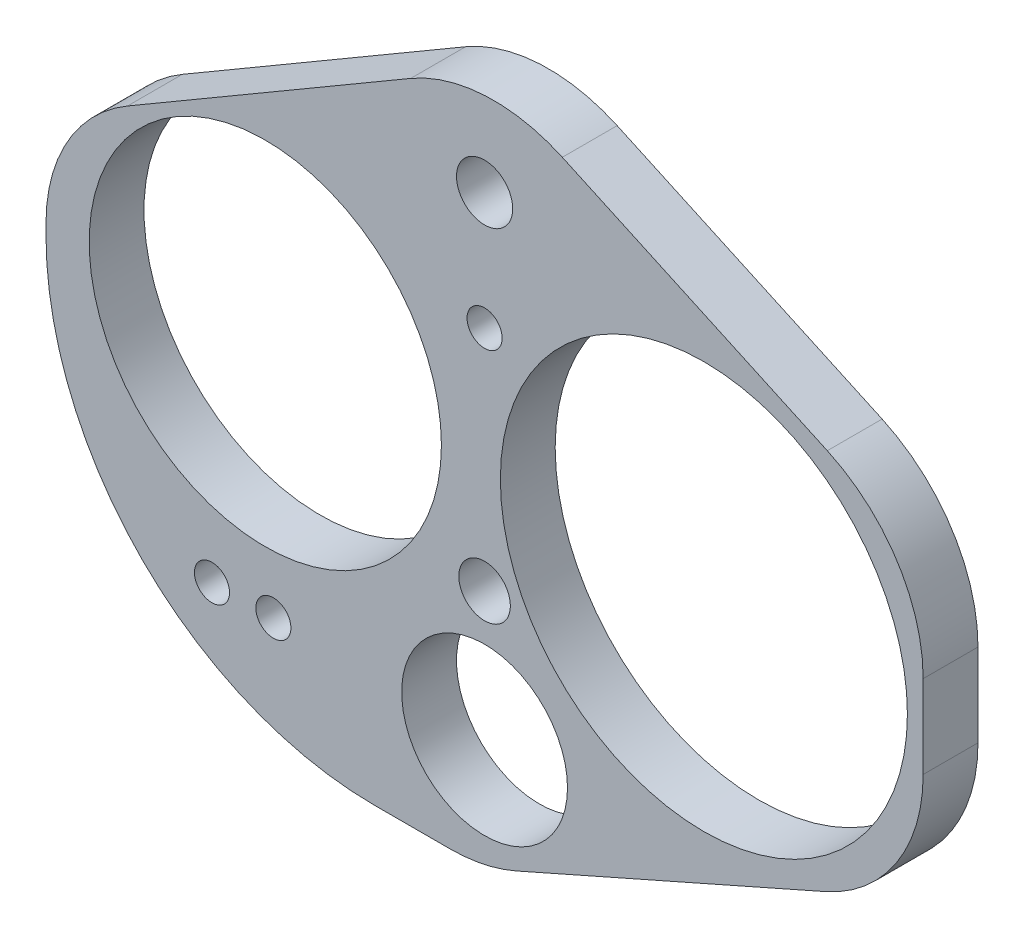
ISO-10303-21;
HEADER;
FILE_DESCRIPTION(('STEP AP214'),'2;1');
FILE_NAME('part.step','',(''),(''),'','','');
FILE_SCHEMA(('AUTOMOTIVE_DESIGN { 1 0 10303 214 1 1 1 1 }'));
ENDSEC;
DATA;
#1=APPLICATION_CONTEXT('core data for automotive mechanical design processes');
#2=APPLICATION_PROTOCOL_DEFINITION('international standard','automotive_design',2000,#1);
#3=PRODUCT_CONTEXT('',#1,'mechanical');
#4=PRODUCT('Part','Part','',(#3));
#5=PRODUCT_RELATED_PRODUCT_CATEGORY('part','',(#4));
#6=PRODUCT_DEFINITION_FORMATION('','',#4);
#7=PRODUCT_DEFINITION_CONTEXT('part definition',#1,'design');
#8=PRODUCT_DEFINITION('design','',#6,#7);
#9=PRODUCT_DEFINITION_SHAPE('','',#8);
#10=(LENGTH_UNIT() NAMED_UNIT(*) SI_UNIT(.MILLI.,.METRE.));
#11=(NAMED_UNIT(*) PLANE_ANGLE_UNIT() SI_UNIT($,.RADIAN.));
#12=(NAMED_UNIT(*) SI_UNIT($,.STERADIAN.) SOLID_ANGLE_UNIT());
#13=UNCERTAINTY_MEASURE_WITH_UNIT(LENGTH_MEASURE(1.E-05),#10,'distance_accuracy_value','');
#14=(GEOMETRIC_REPRESENTATION_CONTEXT(3) GLOBAL_UNCERTAINTY_ASSIGNED_CONTEXT((#13)) GLOBAL_UNIT_ASSIGNED_CONTEXT((#10,
#11,#12)) REPRESENTATION_CONTEXT('',''));
#15=CARTESIAN_POINT('',(0.,0.,0.));
#16=DIRECTION('',(0.,0.,1.));
#17=DIRECTION('',(1.,0.,0.));
#18=AXIS2_PLACEMENT_3D('',#15,#16,#17);
#19=CARTESIAN_POINT('',(14.9199887402892,-33.746005412186,5.));
#20=DIRECTION('',(0.404367078648588,-0.914596777659536,0.));
#21=DIRECTION('',(0.914596777659536,0.404367078648588,0.));
#22=AXIS2_PLACEMENT_3D('',#19,#20,#21);
#23=PLANE('',#22);
#24=DIRECTION('',(-0.914596777659536,-0.404367078648588,0.));
#25=VECTOR('',#24,1.);
#26=CARTESIAN_POINT('',(14.9199887402892,-33.746005412186,5.));
#27=LINE('',#26,#25);
#28=CARTESIAN_POINT('',(51.0655061797288,-17.7651298501373,5.));
#29=VERTEX_POINT('',#28);
#30=CARTESIAN_POINT('',(22.8974729674597,-30.218951664893,5.));
#31=VERTEX_POINT('',#30);
#32=EDGE_CURVE('E255',#29,#31,#27,.T.);
#33=ORIENTED_EDGE('',*,*,#32,.T.);
#34=DIRECTION('',(0.,0.,-1.));
#35=VECTOR('',#34,1.);
#36=CARTESIAN_POINT('',(22.8974729674597,-30.218951664893,0.));
#37=LINE('',#36,#35);
#38=CARTESIAN_POINT('',(22.8974729674597,-30.218951664893,0.));
#39=VERTEX_POINT('',#38);
#40=EDGE_CURVE('E147',#31,#39,#37,.T.);
#41=ORIENTED_EDGE('',*,*,#40,.T.);
#42=DIRECTION('',(-0.914596777659536,-0.404367078648588,0.));
#43=VECTOR('',#42,1.);
#44=CARTESIAN_POINT('',(14.9199887402892,-33.746005412186,0.));
#45=LINE('',#44,#43);
#46=CARTESIAN_POINT('',(51.0655061797288,-17.7651298501373,0.));
#47=VERTEX_POINT('',#46);
#48=EDGE_CURVE('E131',#47,#39,#45,.T.);
#49=ORIENTED_EDGE('',*,*,#48,.F.);
#50=DIRECTION('',(0.,0.,-1.));
#51=VECTOR('',#50,1.);
#52=CARTESIAN_POINT('',(51.0655061797288,-17.7651298501373,5.));
#53=LINE('',#52,#51);
#54=EDGE_CURVE('E144',#47,#29,#53,.F.);
#55=ORIENTED_EDGE('',*,*,#54,.T.);
#56=EDGE_LOOP('',(#33,#41,#49,#55));
#57=FACE_BOUND('',#56,.T.);
#58=ADVANCED_FACE('F41',(#57),#23,.T.);
#59=CARTESIAN_POINT('',(60.,0.,5.));
#60=DIRECTION('',(-1.,0.,0.));
#61=DIRECTION('',(0.,0.,1.));
#62=AXIS2_PLACEMENT_3D('',#59,#60,#61);
#63=PLANE('',#62);
#64=DIRECTION('',(0.,1.,0.));
#65=VECTOR('',#64,1.);
#66=CARTESIAN_POINT('',(60.,0.,5.));
#67=LINE('',#66,#65);
#68=CARTESIAN_POINT('',(60.,-4.04617818524424,5.));
#69=VERTEX_POINT('',#68);
#70=CARTESIAN_POINT('',(60.,3.52175914930494,5.));
#71=VERTEX_POINT('',#70);
#72=EDGE_CURVE('E252',#69,#71,#67,.T.);
#73=ORIENTED_EDGE('',*,*,#72,.F.);
#74=DIRECTION('',(0.,0.,-1.));
#75=VECTOR('',#74,1.);
#76=CARTESIAN_POINT('',(60.,-4.04617818524424,0.));
#77=LINE('',#76,#75);
#78=CARTESIAN_POINT('',(60.,-4.04617818524424,0.));
#79=VERTEX_POINT('',#78);
#80=EDGE_CURVE('E183',#69,#79,#77,.T.);
#81=ORIENTED_EDGE('',*,*,#80,.T.);
#82=DIRECTION('',(0.,1.,0.));
#83=VECTOR('',#82,1.);
#84=CARTESIAN_POINT('',(60.,0.,0.));
#85=LINE('',#84,#83);
#86=CARTESIAN_POINT('',(60.,3.52175914930494,0.));
#87=VERTEX_POINT('',#86);
#88=EDGE_CURVE('E133',#79,#87,#85,.T.);
#89=ORIENTED_EDGE('',*,*,#88,.T.);
#90=DIRECTION('',(0.,0.,-1.));
#91=VECTOR('',#90,1.);
#92=CARTESIAN_POINT('',(60.,3.52175914930494,5.));
#93=LINE('',#92,#91);
#94=EDGE_CURVE('E181',#87,#71,#93,.F.);
#95=ORIENTED_EDGE('',*,*,#94,.T.);
#96=EDGE_LOOP('',(#73,#81,#89,#95));
#97=FACE_BOUND('',#96,.T.);
#98=ADVANCED_FACE('F310',(#97),#63,.F.);
#99=CARTESIAN_POINT('',(15.4215015826315,33.6013254574982,5.));
#100=DIRECTION('',(0.417121690149532,0.908850645379536,0.));
#101=DIRECTION('',(-0.908850645379536,0.417121690149532,0.));
#102=AXIS2_PLACEMENT_3D('',#99,#100,#101);
#103=PLANE('',#102);
#104=DIRECTION('',(0.908850645379536,-0.417121690149532,0.));
#105=VECTOR('',#104,1.);
#106=CARTESIAN_POINT('',(15.4215015826315,33.6013254574982,5.));
#107=LINE('',#106,#105);
#108=CARTESIAN_POINT('',(27.0895478714303,28.2462154474324,5.));
#109=VERTEX_POINT('',#108);
#110=CARTESIAN_POINT('',(51.256825352243,17.154518829998,5.));
#111=VERTEX_POINT('',#110);
#112=EDGE_CURVE('E249',#109,#111,#107,.T.);
#113=ORIENTED_EDGE('',*,*,#112,.T.);
#114=DIRECTION('',(0.,0.,-1.));
#115=VECTOR('',#114,1.);
#116=CARTESIAN_POINT('',(51.256825352243,17.154518829998,0.));
#117=LINE('',#116,#115);
#118=CARTESIAN_POINT('',(51.256825352243,17.154518829998,0.));
#119=VERTEX_POINT('',#118);
#120=EDGE_CURVE('E187',#111,#119,#117,.T.);
#121=ORIENTED_EDGE('',*,*,#120,.T.);
#122=DIRECTION('',(0.908850645379536,-0.417121690149532,0.));
#123=VECTOR('',#122,1.);
#124=CARTESIAN_POINT('',(15.4215015826315,33.6013254574982,0.));
#125=LINE('',#124,#123);
#126=CARTESIAN_POINT('',(27.0895478714303,28.2462154474324,0.));
#127=VERTEX_POINT('',#126);
#128=EDGE_CURVE('E216',#127,#119,#125,.T.);
#129=ORIENTED_EDGE('',*,*,#128,.F.);
#130=DIRECTION('',(0.,0.,-1.));
#131=VECTOR('',#130,1.);
#132=CARTESIAN_POINT('',(27.0895478714303,28.2462154474324,5.));
#133=LINE('',#132,#131);
#134=EDGE_CURVE('E185',#127,#109,#133,.F.);
#135=ORIENTED_EDGE('',*,*,#134,.T.);
#136=EDGE_LOOP('',(#113,#121,#129,#135));
#137=FACE_BOUND('',#136,.T.);
#138=ADVANCED_FACE('F316',(#137),#103,.T.);
#139=CARTESIAN_POINT('',(-8.63068052574687,14.7700800300247,5.));
#140=DIRECTION('',(-0.504516408332865,0.863402104307666,0.));
#141=DIRECTION('',(-0.863402104307666,-0.504516408332865,0.));
#142=AXIS2_PLACEMENT_3D('',#139,#140,#141);
#143=PLANE('',#142);
#144=DIRECTION('',(0.863402104307666,0.504516408332865,0.));
#145=VECTOR('',#144,1.);
#146=CARTESIAN_POINT('',(-8.63068052574687,14.7700800300247,5.));
#147=LINE('',#146,#145);
#148=CARTESIAN_POINT('',(-12.567746124993,12.4695132540203,5.));
#149=VERTEX_POINT('',#148);
#150=CARTESIAN_POINT('',(13.2649763941943,27.5644873313544,5.));
#151=VERTEX_POINT('',#150);
#152=EDGE_CURVE('E246',#149,#151,#147,.T.);
#153=ORIENTED_EDGE('',*,*,#152,.T.);
#154=DIRECTION('',(0.,0.,-1.));
#155=VECTOR('',#154,1.);
#156=CARTESIAN_POINT('',(13.2649763941943,27.5644873313544,5.));
#157=LINE('',#156,#155);
#158=CARTESIAN_POINT('',(13.2649763941943,27.5644873313544,0.));
#159=VERTEX_POINT('',#158);
#160=EDGE_CURVE('E192',#151,#159,#157,.T.);
#161=ORIENTED_EDGE('',*,*,#160,.T.);
#162=DIRECTION('',(0.863402104307666,0.504516408332865,0.));
#163=VECTOR('',#162,1.);
#164=CARTESIAN_POINT('',(-8.63068052574687,14.7700800300247,0.));
#165=LINE('',#164,#163);
#166=CARTESIAN_POINT('',(-12.567746124993,12.4695132540203,0.));
#167=VERTEX_POINT('',#166);
#168=EDGE_CURVE('E213',#167,#159,#165,.T.);
#169=ORIENTED_EDGE('',*,*,#168,.F.);
#170=DIRECTION('',(0.,0.,-1.));
#171=VECTOR('',#170,1.);
#172=CARTESIAN_POINT('',(-12.567746124993,12.4695132540203,5.));
#173=LINE('',#172,#171);
#174=EDGE_CURVE('E190',#167,#149,#173,.F.);
#175=ORIENTED_EDGE('',*,*,#174,.T.);
#176=EDGE_LOOP('',(#153,#161,#169,#175));
#177=FACE_BOUND('',#176,.T.);
#178=ADVANCED_FACE('F370',(#177),#143,.T.);
#179=CARTESIAN_POINT('',(-20.,0.,5.));
#180=DIRECTION('',(-1.,0.,0.));
#181=DIRECTION('',(0.,0.,1.));
#182=AXIS2_PLACEMENT_3D('',#179,#180,#181);
#183=PLANE('',#182);
#184=DIRECTION('',(0.,1.,0.));
#185=VECTOR('',#184,1.);
#186=CARTESIAN_POINT('',(-20.,0.,0.));
#187=LINE('',#186,#185);
#188=CARTESIAN_POINT('',(-20.,-1.49999999999999,0.));
#189=VERTEX_POINT('',#188);
#190=CARTESIAN_POINT('',(-20.,-0.481518310594709,0.));
#191=VERTEX_POINT('',#190);
#192=EDGE_CURVE('E209',#189,#191,#187,.T.);
#193=ORIENTED_EDGE('',*,*,#192,.F.);
#194=DIRECTION('',(0.,0.,-1.));
#195=VECTOR('',#194,1.);
#196=CARTESIAN_POINT('',(-20.,-1.49999999999999,5.));
#197=LINE('',#196,#195);
#198=CARTESIAN_POINT('',(-20.,-1.49999999999999,5.));
#199=VERTEX_POINT('',#198);
#200=EDGE_CURVE('E49',#189,#199,#197,.F.);
#201=ORIENTED_EDGE('',*,*,#200,.T.);
#202=DIRECTION('',(0.,1.,0.));
#203=VECTOR('',#202,1.);
#204=CARTESIAN_POINT('',(-20.,0.,5.));
#205=LINE('',#204,#203);
#206=CARTESIAN_POINT('',(-20.,-0.481518310594709,5.));
#207=VERTEX_POINT('',#206);
#208=EDGE_CURVE('E157',#199,#207,#205,.T.);
#209=ORIENTED_EDGE('',*,*,#208,.T.);
#210=DIRECTION('',(0.,0.,-1.));
#211=VECTOR('',#210,1.);
#212=CARTESIAN_POINT('',(-20.,-0.481518310594709,5.));
#213=LINE('',#212,#211);
#214=EDGE_CURVE('E195',#207,#191,#213,.T.);
#215=ORIENTED_EDGE('',*,*,#214,.T.);
#216=EDGE_LOOP('',(#193,#201,#209,#215));
#217=FACE_BOUND('',#216,.T.);
#218=ADVANCED_FACE('F325',(#217),#183,.T.);
#219=CARTESIAN_POINT('',(0.,0.,5.));
#220=DIRECTION('',(0.,0.,-1.));
#221=DIRECTION('',(-1.,0.,0.));
#222=AXIS2_PLACEMENT_3D('',#219,#220,#221);
#223=CYLINDRICAL_SURFACE('',#222,16.0625);
#224=CARTESIAN_POINT('',(0.,0.,5.));
#225=DIRECTION('',(0.,0.,1.));
#226=DIRECTION('',(1.,0.,0.));
#227=AXIS2_PLACEMENT_3D('',#224,#225,#226);
#228=CIRCLE('',#227,16.0625);
#229=CARTESIAN_POINT('',(16.0625,0.,5.));
#230=VERTEX_POINT('',#229);
#231=EDGE_CURVE('E257',#230,#230,#228,.T.);
#232=ORIENTED_EDGE('',*,*,#231,.T.);
#233=EDGE_LOOP('',(#232));
#234=FACE_BOUND('',#233,.T.);
#235=CARTESIAN_POINT('',(0.,0.,0.));
#236=DIRECTION('',(0.,0.,1.));
#237=DIRECTION('',(1.,0.,0.));
#238=AXIS2_PLACEMENT_3D('',#235,#236,#237);
#239=CIRCLE('',#238,16.0625);
#240=CARTESIAN_POINT('',(16.0625,0.,0.));
#241=VERTEX_POINT('',#240);
#242=EDGE_CURVE('E148',#241,#241,#239,.T.);
#243=ORIENTED_EDGE('',*,*,#242,.F.);
#244=EDGE_LOOP('',(#243));
#245=FACE_BOUND('',#244,.T.);
#246=ADVANCED_FACE('F321',(#234,#245),#223,.F.);
#247=CARTESIAN_POINT('',(40.,0.,5.));
#248=DIRECTION('',(0.,0.,-1.));
#249=DIRECTION('',(-1.,0.,0.));
#250=AXIS2_PLACEMENT_3D('',#247,#248,#249);
#251=CYLINDRICAL_SURFACE('',#250,18.5625);
#252=CARTESIAN_POINT('',(40.,0.,5.));
#253=DIRECTION('',(0.,0.,1.));
#254=DIRECTION('',(1.,0.,0.));
#255=AXIS2_PLACEMENT_3D('',#252,#253,#254);
#256=CIRCLE('',#255,18.5625);
#257=CARTESIAN_POINT('',(58.5625,0.,5.));
#258=VERTEX_POINT('',#257);
#259=EDGE_CURVE('E260',#258,#258,#256,.T.);
#260=ORIENTED_EDGE('',*,*,#259,.T.);
#261=EDGE_LOOP('',(#260));
#262=FACE_BOUND('',#261,.T.);
#263=CARTESIAN_POINT('',(40.,0.,0.));
#264=DIRECTION('',(0.,0.,1.));
#265=DIRECTION('',(1.,0.,0.));
#266=AXIS2_PLACEMENT_3D('',#263,#264,#265);
#267=CIRCLE('',#266,18.5625);
#268=CARTESIAN_POINT('',(58.5625,0.,0.));
#269=VERTEX_POINT('',#268);
#270=EDGE_CURVE('E224',#269,#269,#267,.T.);
#271=ORIENTED_EDGE('',*,*,#270,.F.);
#272=EDGE_LOOP('',(#271));
#273=FACE_BOUND('',#272,.T.);
#274=ADVANCED_FACE('F324',(#262,#273),#251,.F.);
#275=CARTESIAN_POINT('',(20.,11.2090057759171,5.));
#276=DIRECTION('',(0.,0.,-1.));
#277=DIRECTION('',(-1.,0.,0.));
#278=AXIS2_PLACEMENT_3D('',#275,#276,#277);
#279=CYLINDRICAL_SURFACE('',#278,1.6);
#280=CARTESIAN_POINT('',(20.,11.2090057759171,5.));
#281=DIRECTION('',(0.,0.,1.));
#282=DIRECTION('',(1.,0.,0.));
#283=AXIS2_PLACEMENT_3D('',#280,#281,#282);
#284=CIRCLE('',#283,1.6);
#285=CARTESIAN_POINT('',(21.6,11.2090057759171,5.));
#286=VERTEX_POINT('',#285);
#287=EDGE_CURVE('E263',#286,#286,#284,.T.);
#288=ORIENTED_EDGE('',*,*,#287,.T.);
#289=EDGE_LOOP('',(#288));
#290=FACE_BOUND('',#289,.T.);
#291=CARTESIAN_POINT('',(20.,11.2090057759171,0.));
#292=DIRECTION('',(0.,0.,1.));
#293=DIRECTION('',(1.,0.,0.));
#294=AXIS2_PLACEMENT_3D('',#291,#292,#293);
#295=CIRCLE('',#294,1.6);
#296=CARTESIAN_POINT('',(21.6,11.2090057759171,0.));
#297=VERTEX_POINT('',#296);
#298=EDGE_CURVE('E227',#297,#297,#295,.T.);
#299=ORIENTED_EDGE('',*,*,#298,.F.);
#300=EDGE_LOOP('',(#299));
#301=FACE_BOUND('',#300,.T.);
#302=ADVANCED_FACE('F329',(#290,#301),#279,.F.);
#303=CARTESIAN_POINT('',(20.,-9.55709597672603,5.));
#304=DIRECTION('',(0.,0.,-1.));
#305=DIRECTION('',(-1.,0.,0.));
#306=AXIS2_PLACEMENT_3D('',#303,#304,#305);
#307=CYLINDRICAL_SURFACE('',#306,2.35);
#308=CARTESIAN_POINT('',(20.,-9.55709597672603,5.));
#309=DIRECTION('',(0.,0.,1.));
#310=DIRECTION('',(1.,0.,0.));
#311=AXIS2_PLACEMENT_3D('',#308,#309,#310);
#312=CIRCLE('',#311,2.35);
#313=CARTESIAN_POINT('',(22.35,-9.55709597672603,5.));
#314=VERTEX_POINT('',#313);
#315=EDGE_CURVE('E266',#314,#314,#312,.T.);
#316=ORIENTED_EDGE('',*,*,#315,.T.);
#317=EDGE_LOOP('',(#316));
#318=FACE_BOUND('',#317,.T.);
#319=CARTESIAN_POINT('',(20.,-9.55709597672603,0.));
#320=DIRECTION('',(0.,0.,1.));
#321=DIRECTION('',(1.,0.,0.));
#322=AXIS2_PLACEMENT_3D('',#319,#320,#321);
#323=CIRCLE('',#322,2.35);
#324=CARTESIAN_POINT('',(22.35,-9.55709597672603,0.));
#325=VERTEX_POINT('',#324);
#326=EDGE_CURVE('E230',#325,#325,#323,.T.);
#327=ORIENTED_EDGE('',*,*,#326,.F.);
#328=EDGE_LOOP('',(#327));
#329=FACE_BOUND('',#328,.T.);
#330=ADVANCED_FACE('F333',(#318,#329),#307,.F.);
#331=CARTESIAN_POINT('',(20.,21.9185676860853,5.));
#332=DIRECTION('',(0.,0.,-1.));
#333=DIRECTION('',(-1.,0.,0.));
#334=AXIS2_PLACEMENT_3D('',#331,#332,#333);
#335=CYLINDRICAL_SURFACE('',#334,2.5625);
#336=CARTESIAN_POINT('',(20.,21.9185676860853,5.));
#337=DIRECTION('',(0.,0.,1.));
#338=DIRECTION('',(1.,0.,0.));
#339=AXIS2_PLACEMENT_3D('',#336,#337,#338);
#340=CIRCLE('',#339,2.5625);
#341=CARTESIAN_POINT('',(22.5625,21.9185676860853,5.));
#342=VERTEX_POINT('',#341);
#343=EDGE_CURVE('E269',#342,#342,#340,.T.);
#344=ORIENTED_EDGE('',*,*,#343,.T.);
#345=EDGE_LOOP('',(#344));
#346=FACE_BOUND('',#345,.T.);
#347=CARTESIAN_POINT('',(20.,21.9185676860853,0.));
#348=DIRECTION('',(0.,0.,1.));
#349=DIRECTION('',(1.,0.,0.));
#350=AXIS2_PLACEMENT_3D('',#347,#348,#349);
#351=CIRCLE('',#350,2.5625);
#352=CARTESIAN_POINT('',(22.5625,21.9185676860853,0.));
#353=VERTEX_POINT('',#352);
#354=EDGE_CURVE('E233',#353,#353,#351,.T.);
#355=ORIENTED_EDGE('',*,*,#354,.F.);
#356=EDGE_LOOP('',(#355));
#357=FACE_BOUND('',#356,.T.);
#358=ADVANCED_FACE('F337',(#346,#357),#335,.F.);
#359=CARTESIAN_POINT('',(20.,-21.3168118663369,5.));
#360=DIRECTION('',(0.,0.,-1.));
#361=DIRECTION('',(-1.,0.,0.));
#362=AXIS2_PLACEMENT_3D('',#359,#360,#361);
#363=CYLINDRICAL_SURFACE('',#362,7.5625);
#364=CARTESIAN_POINT('',(20.,-21.3168118663369,5.));
#365=DIRECTION('',(0.,0.,1.));
#366=DIRECTION('',(1.,0.,0.));
#367=AXIS2_PLACEMENT_3D('',#364,#365,#366);
#368=CIRCLE('',#367,7.5625);
#369=CARTESIAN_POINT('',(27.5625,-21.3168118663369,5.));
#370=VERTEX_POINT('',#369);
#371=EDGE_CURVE('E272',#370,#370,#368,.T.);
#372=ORIENTED_EDGE('',*,*,#371,.T.);
#373=EDGE_LOOP('',(#372));
#374=FACE_BOUND('',#373,.T.);
#375=CARTESIAN_POINT('',(20.,-21.3168118663369,0.));
#376=DIRECTION('',(0.,0.,1.));
#377=DIRECTION('',(1.,0.,0.));
#378=AXIS2_PLACEMENT_3D('',#375,#376,#377);
#379=CIRCLE('',#378,7.5625);
#380=CARTESIAN_POINT('',(27.5625,-21.3168118663369,0.));
#381=VERTEX_POINT('',#380);
#382=EDGE_CURVE('E236',#381,#381,#379,.T.);
#383=ORIENTED_EDGE('',*,*,#382,.F.);
#384=EDGE_LOOP('',(#383));
#385=FACE_BOUND('',#384,.T.);
#386=ADVANCED_FACE('F341',(#374,#385),#363,.F.);
#387=CARTESIAN_POINT('',(0.737105173144215,-21.3168118663369,5.));
#388=DIRECTION('',(0.,0.,-1.));
#389=DIRECTION('',(-1.,0.,0.));
#390=AXIS2_PLACEMENT_3D('',#387,#388,#389);
#391=CYLINDRICAL_SURFACE('',#390,1.6);
#392=CARTESIAN_POINT('',(0.737105173144215,-21.3168118663369,5.));
#393=DIRECTION('',(0.,0.,1.));
#394=DIRECTION('',(1.,0.,0.));
#395=AXIS2_PLACEMENT_3D('',#392,#393,#394);
#396=CIRCLE('',#395,1.6);
#397=CARTESIAN_POINT('',(2.33710517314422,-21.3168118663369,5.));
#398=VERTEX_POINT('',#397);
#399=EDGE_CURVE('E211',#398,#398,#396,.T.);
#400=ORIENTED_EDGE('',*,*,#399,.T.);
#401=EDGE_LOOP('',(#400));
#402=FACE_BOUND('',#401,.T.);
#403=CARTESIAN_POINT('',(0.737105173144215,-21.3168118663369,0.));
#404=DIRECTION('',(0.,0.,1.));
#405=DIRECTION('',(1.,0.,0.));
#406=AXIS2_PLACEMENT_3D('',#403,#404,#405);
#407=CIRCLE('',#406,1.6);
#408=CARTESIAN_POINT('',(2.33710517314422,-21.3168118663369,0.));
#409=VERTEX_POINT('',#408);
#410=EDGE_CURVE('E239',#409,#409,#407,.T.);
#411=ORIENTED_EDGE('',*,*,#410,.F.);
#412=EDGE_LOOP('',(#411));
#413=FACE_BOUND('',#412,.T.);
#414=ADVANCED_FACE('F278',(#402,#413),#391,.F.);
#415=CARTESIAN_POINT('',(-4.86289482685578,-21.3168118663369,5.));
#416=DIRECTION('',(0.,0.,-1.));
#417=DIRECTION('',(-1.,0.,0.));
#418=AXIS2_PLACEMENT_3D('',#415,#416,#417);
#419=CYLINDRICAL_SURFACE('',#418,1.6);
#420=CARTESIAN_POINT('',(-4.86289482685578,-21.3168118663369,5.));
#421=DIRECTION('',(0.,0.,1.));
#422=DIRECTION('',(1.,0.,0.));
#423=AXIS2_PLACEMENT_3D('',#420,#421,#422);
#424=CIRCLE('',#423,1.6);
#425=CARTESIAN_POINT('',(-3.26289482685578,-21.3168118663369,5.));
#426=VERTEX_POINT('',#425);
#427=EDGE_CURVE('E208',#426,#426,#424,.T.);
#428=ORIENTED_EDGE('',*,*,#427,.T.);
#429=EDGE_LOOP('',(#428));
#430=FACE_BOUND('',#429,.T.);
#431=CARTESIAN_POINT('',(-4.86289482685578,-21.3168118663369,0.));
#432=DIRECTION('',(0.,0.,1.));
#433=DIRECTION('',(1.,0.,0.));
#434=AXIS2_PLACEMENT_3D('',#431,#432,#433);
#435=CIRCLE('',#434,1.6);
#436=CARTESIAN_POINT('',(-3.26289482685578,-21.3168118663369,0.));
#437=VERTEX_POINT('',#436);
#438=EDGE_CURVE('E242',#437,#437,#435,.T.);
#439=ORIENTED_EDGE('',*,*,#438,.F.);
#440=EDGE_LOOP('',(#439));
#441=FACE_BOUND('',#440,.T.);
#442=ADVANCED_FACE('F348',(#430,#441),#419,.F.);
#443=CARTESIAN_POINT('',(0.,-31.5,5.));
#444=DIRECTION('',(0.,1.,0.));
#445=DIRECTION('',(0.,0.,1.));
#446=AXIS2_PLACEMENT_3D('',#443,#444,#445);
#447=PLANE('',#446);
#448=DIRECTION('',(1.,0.,0.));
#449=VECTOR('',#448,1.);
#450=CARTESIAN_POINT('',(0.,-31.5,5.));
#451=LINE('',#450,#449);
#452=CARTESIAN_POINT('',(9.99999999999999,-31.5,5.));
#453=VERTEX_POINT('',#452);
#454=CARTESIAN_POINT('',(16.8319667877309,-31.5,5.));
#455=VERTEX_POINT('',#454);
#456=EDGE_CURVE('E153',#453,#455,#451,.T.);
#457=ORIENTED_EDGE('',*,*,#456,.F.);
#458=DIRECTION('',(0.,0.,-1.));
#459=VECTOR('',#458,1.);
#460=CARTESIAN_POINT('',(9.99999999999999,-31.5,0.));
#461=LINE('',#460,#459);
#462=CARTESIAN_POINT('',(9.99999999999999,-31.5,0.));
#463=VERTEX_POINT('',#462);
#464=EDGE_CURVE('E198',#453,#463,#461,.T.);
#465=ORIENTED_EDGE('',*,*,#464,.T.);
#466=DIRECTION('',(1.,0.,0.));
#467=VECTOR('',#466,1.);
#468=CARTESIAN_POINT('',(0.,-31.5,0.));
#469=LINE('',#468,#467);
#470=CARTESIAN_POINT('',(16.8319667877309,-31.5,0.));
#471=VERTEX_POINT('',#470);
#472=EDGE_CURVE('E160',#463,#471,#469,.T.);
#473=ORIENTED_EDGE('',*,*,#472,.T.);
#474=DIRECTION('',(0.,0.,-1.));
#475=VECTOR('',#474,1.);
#476=CARTESIAN_POINT('',(16.8319667877309,-31.5,5.));
#477=LINE('',#476,#475);
#478=EDGE_CURVE('E168',#471,#455,#477,.F.);
#479=ORIENTED_EDGE('',*,*,#478,.T.);
#480=EDGE_LOOP('',(#457,#465,#473,#479));
#481=FACE_BOUND('',#480,.T.);
#482=ADVANCED_FACE('F204',(#481),#447,.F.);
#483=CARTESIAN_POINT('',(0.,0.,5.));
#484=DIRECTION('',(0.,0.,1.));
#485=DIRECTION('',(1.,0.,0.));
#486=AXIS2_PLACEMENT_3D('',#483,#484,#485);
#487=PLANE('',#486);
#488=ORIENTED_EDGE('',*,*,#427,.F.);
#489=EDGE_LOOP('',(#488));
#490=FACE_BOUND('',#489,.T.);
#491=ORIENTED_EDGE('',*,*,#399,.F.);
#492=EDGE_LOOP('',(#491));
#493=FACE_BOUND('',#492,.T.);
#494=ORIENTED_EDGE('',*,*,#371,.F.);
#495=EDGE_LOOP('',(#494));
#496=FACE_BOUND('',#495,.T.);
#497=ORIENTED_EDGE('',*,*,#343,.F.);
#498=EDGE_LOOP('',(#497));
#499=FACE_BOUND('',#498,.T.);
#500=ORIENTED_EDGE('',*,*,#315,.F.);
#501=EDGE_LOOP('',(#500));
#502=FACE_BOUND('',#501,.T.);
#503=ORIENTED_EDGE('',*,*,#287,.F.);
#504=EDGE_LOOP('',(#503));
#505=FACE_BOUND('',#504,.T.);
#506=ORIENTED_EDGE('',*,*,#259,.F.);
#507=EDGE_LOOP('',(#506));
#508=FACE_BOUND('',#507,.T.);
#509=ORIENTED_EDGE('',*,*,#231,.F.);
#510=EDGE_LOOP('',(#509));
#511=FACE_BOUND('',#510,.T.);
#512=ORIENTED_EDGE('',*,*,#208,.F.);
#513=CARTESIAN_POINT('',(9.99999999999999,-1.49999999999999,5.));
#514=DIRECTION('',(0.,0.,1.));
#515=DIRECTION('',(1.,0.,0.));
#516=AXIS2_PLACEMENT_3D('',#513,#514,#515);
#517=CIRCLE('',#516,30.);
#518=EDGE_CURVE('E11',#199,#453,#517,.T.);
#519=ORIENTED_EDGE('',*,*,#518,.T.);
#520=ORIENTED_EDGE('',*,*,#456,.T.);
#521=CARTESIAN_POINT('',(16.8319667877309,-16.5,5.));
#522=DIRECTION('',(0.,0.,1.));
#523=DIRECTION('',(1.,0.,0.));
#524=AXIS2_PLACEMENT_3D('',#521,#522,#523);
#525=CIRCLE('',#524,15.);
#526=EDGE_CURVE('E179',#455,#31,#525,.T.);
#527=ORIENTED_EDGE('',*,*,#526,.T.);
#528=ORIENTED_EDGE('',*,*,#32,.F.);
#529=CARTESIAN_POINT('',(45.,-4.04617818524424,5.));
#530=DIRECTION('',(0.,0.,1.));
#531=DIRECTION('',(1.,0.,0.));
#532=AXIS2_PLACEMENT_3D('',#529,#530,#531);
#533=CIRCLE('',#532,15.);
#534=EDGE_CURVE('E152',#29,#69,#533,.T.);
#535=ORIENTED_EDGE('',*,*,#534,.T.);
#536=ORIENTED_EDGE('',*,*,#72,.T.);
#537=CARTESIAN_POINT('',(45.,3.52175914930494,5.));
#538=DIRECTION('',(0.,0.,1.));
#539=DIRECTION('',(1.,0.,0.));
#540=AXIS2_PLACEMENT_3D('',#537,#538,#539);
#541=CIRCLE('',#540,15.);
#542=EDGE_CURVE('E176',#71,#111,#541,.T.);
#543=ORIENTED_EDGE('',*,*,#542,.T.);
#544=ORIENTED_EDGE('',*,*,#112,.F.);
#545=CARTESIAN_POINT('',(20.8327225191873,14.6134557667394,5.));
#546=DIRECTION('',(0.,0.,1.));
#547=DIRECTION('',(1.,0.,0.));
#548=AXIS2_PLACEMENT_3D('',#545,#546,#547);
#549=CIRCLE('',#548,15.);
#550=EDGE_CURVE('E174',#109,#151,#549,.T.);
#551=ORIENTED_EDGE('',*,*,#550,.T.);
#552=ORIENTED_EDGE('',*,*,#152,.F.);
#553=CARTESIAN_POINT('',(-5.00000000000001,-0.481518310594709,5.));
#554=DIRECTION('',(0.,0.,1.));
#555=DIRECTION('',(1.,0.,0.));
#556=AXIS2_PLACEMENT_3D('',#553,#554,#555);
#557=CIRCLE('',#556,15.);
#558=EDGE_CURVE('E171',#149,#207,#557,.T.);
#559=ORIENTED_EDGE('',*,*,#558,.T.);
#560=EDGE_LOOP('',(#512,#519,#520,#527,#528,#535,#536,#543,#544,#551,#552,#559));
#561=FACE_BOUND('',#560,.T.);
#562=ADVANCED_FACE('F281',(#490,#493,#496,#499,#502,#505,#508,#511,#561),#487,.T.);
#563=CARTESIAN_POINT('',(0.,0.,0.));
#564=DIRECTION('',(0.,0.,1.));
#565=DIRECTION('',(1.,0.,0.));
#566=AXIS2_PLACEMENT_3D('',#563,#564,#565);
#567=PLANE('',#566);
#568=ORIENTED_EDGE('',*,*,#438,.T.);
#569=EDGE_LOOP('',(#568));
#570=FACE_BOUND('',#569,.T.);
#571=ORIENTED_EDGE('',*,*,#410,.T.);
#572=EDGE_LOOP('',(#571));
#573=FACE_BOUND('',#572,.T.);
#574=ORIENTED_EDGE('',*,*,#382,.T.);
#575=EDGE_LOOP('',(#574));
#576=FACE_BOUND('',#575,.T.);
#577=ORIENTED_EDGE('',*,*,#354,.T.);
#578=EDGE_LOOP('',(#577));
#579=FACE_BOUND('',#578,.T.);
#580=ORIENTED_EDGE('',*,*,#326,.T.);
#581=EDGE_LOOP('',(#580));
#582=FACE_BOUND('',#581,.T.);
#583=ORIENTED_EDGE('',*,*,#298,.T.);
#584=EDGE_LOOP('',(#583));
#585=FACE_BOUND('',#584,.T.);
#586=ORIENTED_EDGE('',*,*,#270,.T.);
#587=EDGE_LOOP('',(#586));
#588=FACE_BOUND('',#587,.T.);
#589=ORIENTED_EDGE('',*,*,#242,.T.);
#590=EDGE_LOOP('',(#589));
#591=FACE_BOUND('',#590,.T.);
#592=ORIENTED_EDGE('',*,*,#472,.F.);
#593=CARTESIAN_POINT('',(9.99999999999999,-1.49999999999999,0.));
#594=DIRECTION('',(0.,0.,1.));
#595=DIRECTION('',(1.,0.,0.));
#596=AXIS2_PLACEMENT_3D('',#593,#594,#595);
#597=CIRCLE('',#596,30.);
#598=EDGE_CURVE('E63',#463,#189,#597,.F.);
#599=ORIENTED_EDGE('',*,*,#598,.T.);
#600=ORIENTED_EDGE('',*,*,#192,.T.);
#601=CARTESIAN_POINT('',(-5.00000000000001,-0.481518310594709,0.));
#602=DIRECTION('',(0.,0.,1.));
#603=DIRECTION('',(1.,0.,0.));
#604=AXIS2_PLACEMENT_3D('',#601,#602,#603);
#605=CIRCLE('',#604,15.);
#606=EDGE_CURVE('E155',#191,#167,#605,.F.);
#607=ORIENTED_EDGE('',*,*,#606,.T.);
#608=ORIENTED_EDGE('',*,*,#168,.T.);
#609=CARTESIAN_POINT('',(20.8327225191873,14.6134557667394,0.));
#610=DIRECTION('',(0.,0.,1.));
#611=DIRECTION('',(1.,0.,0.));
#612=AXIS2_PLACEMENT_3D('',#609,#610,#611);
#613=CIRCLE('',#612,15.);
#614=EDGE_CURVE('E164',#159,#127,#613,.F.);
#615=ORIENTED_EDGE('',*,*,#614,.T.);
#616=ORIENTED_EDGE('',*,*,#128,.T.);
#617=CARTESIAN_POINT('',(45.,3.52175914930494,0.));
#618=DIRECTION('',(0.,0.,1.));
#619=DIRECTION('',(1.,0.,0.));
#620=AXIS2_PLACEMENT_3D('',#617,#618,#619);
#621=CIRCLE('',#620,15.);
#622=EDGE_CURVE('E139',#119,#87,#621,.F.);
#623=ORIENTED_EDGE('',*,*,#622,.T.);
#624=ORIENTED_EDGE('',*,*,#88,.F.);
#625=CARTESIAN_POINT('',(45.,-4.04617818524424,0.));
#626=DIRECTION('',(0.,0.,1.));
#627=DIRECTION('',(1.,0.,0.));
#628=AXIS2_PLACEMENT_3D('',#625,#626,#627);
#629=CIRCLE('',#628,15.);
#630=EDGE_CURVE('E127',#79,#47,#629,.F.);
#631=ORIENTED_EDGE('',*,*,#630,.T.);
#632=ORIENTED_EDGE('',*,*,#48,.T.);
#633=CARTESIAN_POINT('',(16.8319667877309,-16.5,0.));
#634=DIRECTION('',(0.,0.,1.));
#635=DIRECTION('',(1.,0.,0.));
#636=AXIS2_PLACEMENT_3D('',#633,#634,#635);
#637=CIRCLE('',#636,15.);
#638=EDGE_CURVE('E138',#39,#471,#637,.F.);
#639=ORIENTED_EDGE('',*,*,#638,.T.);
#640=EDGE_LOOP('',(#592,#599,#600,#607,#608,#615,#616,#623,#624,#631,#632,#639));
#641=FACE_BOUND('',#640,.T.);
#642=ADVANCED_FACE('F129',(#570,#573,#576,#579,#582,#585,#588,#591,#641),#567,.F.);
#643=CARTESIAN_POINT('',(16.8319667877309,-16.5,5.));
#644=DIRECTION('',(0.,0.,1.));
#645=DIRECTION('',(1.,0.,0.));
#646=AXIS2_PLACEMENT_3D('',#643,#644,#645);
#647=CYLINDRICAL_SURFACE('',#646,15.);
#648=ORIENTED_EDGE('',*,*,#526,.F.);
#649=ORIENTED_EDGE('',*,*,#478,.F.);
#650=ORIENTED_EDGE('',*,*,#638,.F.);
#651=ORIENTED_EDGE('',*,*,#40,.F.);
#652=EDGE_LOOP('',(#648,#649,#650,#651));
#653=FACE_BOUND('',#652,.T.);
#654=ADVANCED_FACE('F351',(#653),#647,.T.);
#655=CARTESIAN_POINT('',(45.,-4.04617818524424,5.));
#656=DIRECTION('',(0.,0.,1.));
#657=DIRECTION('',(1.,0.,0.));
#658=AXIS2_PLACEMENT_3D('',#655,#656,#657);
#659=CYLINDRICAL_SURFACE('',#658,15.);
#660=ORIENTED_EDGE('',*,*,#534,.F.);
#661=ORIENTED_EDGE('',*,*,#54,.F.);
#662=ORIENTED_EDGE('',*,*,#630,.F.);
#663=ORIENTED_EDGE('',*,*,#80,.F.);
#664=EDGE_LOOP('',(#660,#661,#662,#663));
#665=FACE_BOUND('',#664,.T.);
#666=ADVANCED_FACE('F151',(#665),#659,.T.);
#667=CARTESIAN_POINT('',(45.,3.52175914930494,5.));
#668=DIRECTION('',(0.,0.,1.));
#669=DIRECTION('',(1.,0.,0.));
#670=AXIS2_PLACEMENT_3D('',#667,#668,#669);
#671=CYLINDRICAL_SURFACE('',#670,15.);
#672=ORIENTED_EDGE('',*,*,#542,.F.);
#673=ORIENTED_EDGE('',*,*,#94,.F.);
#674=ORIENTED_EDGE('',*,*,#622,.F.);
#675=ORIENTED_EDGE('',*,*,#120,.F.);
#676=EDGE_LOOP('',(#672,#673,#674,#675));
#677=FACE_BOUND('',#676,.T.);
#678=ADVANCED_FACE('F357',(#677),#671,.T.);
#679=CARTESIAN_POINT('',(20.8327225191873,14.6134557667394,5.));
#680=DIRECTION('',(0.,0.,-1.));
#681=DIRECTION('',(-1.,0.,0.));
#682=AXIS2_PLACEMENT_3D('',#679,#680,#681);
#683=CYLINDRICAL_SURFACE('',#682,15.);
#684=ORIENTED_EDGE('',*,*,#550,.F.);
#685=ORIENTED_EDGE('',*,*,#134,.F.);
#686=ORIENTED_EDGE('',*,*,#614,.F.);
#687=ORIENTED_EDGE('',*,*,#160,.F.);
#688=EDGE_LOOP('',(#684,#685,#686,#687));
#689=FACE_BOUND('',#688,.T.);
#690=ADVANCED_FACE('F307',(#689),#683,.T.);
#691=CARTESIAN_POINT('',(-5.00000000000001,-0.481518310594709,5.));
#692=DIRECTION('',(0.,0.,-1.));
#693=DIRECTION('',(-1.,0.,0.));
#694=AXIS2_PLACEMENT_3D('',#691,#692,#693);
#695=CYLINDRICAL_SURFACE('',#694,15.);
#696=ORIENTED_EDGE('',*,*,#558,.F.);
#697=ORIENTED_EDGE('',*,*,#174,.F.);
#698=ORIENTED_EDGE('',*,*,#606,.F.);
#699=ORIENTED_EDGE('',*,*,#214,.F.);
#700=EDGE_LOOP('',(#696,#697,#698,#699));
#701=FACE_BOUND('',#700,.T.);
#702=ADVANCED_FACE('F302',(#701),#695,.T.);
#703=CARTESIAN_POINT('',(9.99999999999999,-1.49999999999999,5.));
#704=DIRECTION('',(0.,0.,1.));
#705=DIRECTION('',(1.,0.,0.));
#706=AXIS2_PLACEMENT_3D('',#703,#704,#705);
#707=CYLINDRICAL_SURFACE('',#706,30.);
#708=ORIENTED_EDGE('',*,*,#518,.F.);
#709=ORIENTED_EDGE('',*,*,#200,.F.);
#710=ORIENTED_EDGE('',*,*,#598,.F.);
#711=ORIENTED_EDGE('',*,*,#464,.F.);
#712=EDGE_LOOP('',(#708,#709,#710,#711));
#713=FACE_BOUND('',#712,.T.);
#714=ADVANCED_FACE('F43',(#713),#707,.T.);
#715=CLOSED_SHELL('',(#58,#98,#138,#178,#218,#246,#274,#302,#330,#358,#386,#414,#442,#482,#562,
#642,#654,#666,#678,#690,#702,#714));
#716=MANIFOLD_SOLID_BREP('B2',#715);
#717=ADVANCED_BREP_SHAPE_REPRESENTATION('',(#18,#716),#14);
#718=SHAPE_DEFINITION_REPRESENTATION(#9,#717);
ENDSEC;
END-ISO-10303-21;
